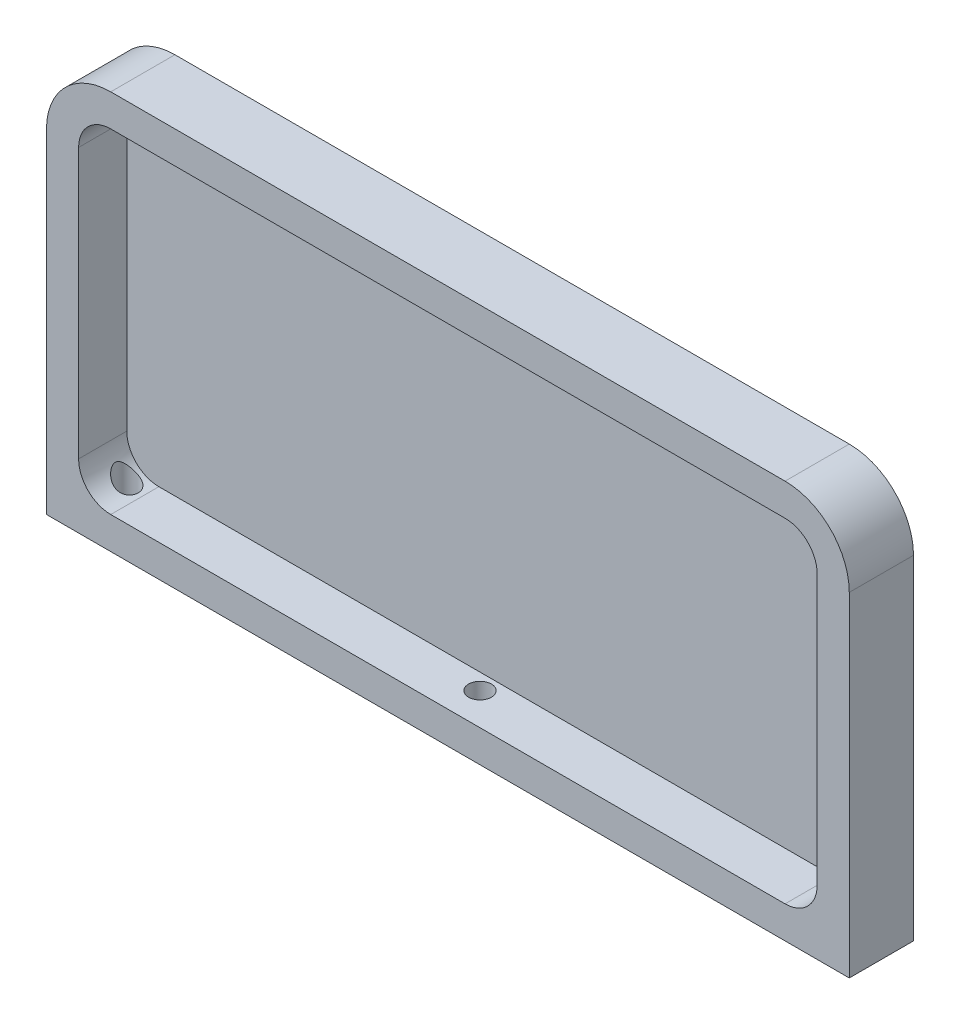
ISO-10303-21;
HEADER;
FILE_DESCRIPTION(('STEP AP214'),'2;1');
FILE_NAME('part.step','',(''),(''),'','','');
FILE_SCHEMA(('AUTOMOTIVE_DESIGN { 1 0 10303 214 1 1 1 1 }'));
ENDSEC;
DATA;
#1=APPLICATION_CONTEXT('core data for automotive mechanical design processes');
#2=APPLICATION_PROTOCOL_DEFINITION('international standard','automotive_design',2000,#1);
#3=PRODUCT_CONTEXT('',#1,'mechanical');
#4=PRODUCT('Part','Part','',(#3));
#5=PRODUCT_RELATED_PRODUCT_CATEGORY('part','',(#4));
#6=PRODUCT_DEFINITION_FORMATION('','',#4);
#7=PRODUCT_DEFINITION_CONTEXT('part definition',#1,'design');
#8=PRODUCT_DEFINITION('design','',#6,#7);
#9=PRODUCT_DEFINITION_SHAPE('','',#8);
#10=(LENGTH_UNIT() NAMED_UNIT(*) SI_UNIT(.MILLI.,.METRE.));
#11=(NAMED_UNIT(*) PLANE_ANGLE_UNIT() SI_UNIT($,.RADIAN.));
#12=(NAMED_UNIT(*) SI_UNIT($,.STERADIAN.) SOLID_ANGLE_UNIT());
#13=UNCERTAINTY_MEASURE_WITH_UNIT(LENGTH_MEASURE(1.E-05),#10,'distance_accuracy_value','');
#14=(GEOMETRIC_REPRESENTATION_CONTEXT(3) GLOBAL_UNCERTAINTY_ASSIGNED_CONTEXT((#13)) GLOBAL_UNIT_ASSIGNED_CONTEXT((#10,
#11,#12)) REPRESENTATION_CONTEXT('',''));
#15=CARTESIAN_POINT('',(0.,0.,0.));
#16=DIRECTION('',(0.,0.,1.));
#17=DIRECTION('',(1.,0.,0.));
#18=AXIS2_PLACEMENT_3D('',#15,#16,#17);
#19=CARTESIAN_POINT('',(39.6875,-19.685,6.35));
#20=DIRECTION('',(-1.,0.,0.));
#21=DIRECTION('',(0.,0.,1.));
#22=AXIS2_PLACEMENT_3D('',#19,#20,#21);
#23=PLANE('',#22);
#24=DIRECTION('',(0.,1.,0.));
#25=VECTOR('',#24,1.);
#26=CARTESIAN_POINT('',(39.6875,-19.685,0.));
#27=LINE('',#26,#25);
#28=CARTESIAN_POINT('',(39.6875,-19.685,0.));
#29=VERTEX_POINT('',#28);
#30=CARTESIAN_POINT('',(39.6875,13.335,0.));
#31=VERTEX_POINT('',#30);
#32=EDGE_CURVE('E225',#29,#31,#27,.T.);
#33=ORIENTED_EDGE('',*,*,#32,.T.);
#34=DIRECTION('',(0.,0.,-1.));
#35=VECTOR('',#34,1.);
#36=CARTESIAN_POINT('',(39.6875,13.335,6.35));
#37=LINE('',#36,#35);
#38=CARTESIAN_POINT('',(39.6875,13.335,6.35));
#39=VERTEX_POINT('',#38);
#40=EDGE_CURVE('E259',#31,#39,#37,.F.);
#41=ORIENTED_EDGE('',*,*,#40,.T.);
#42=DIRECTION('',(0.,1.,0.));
#43=VECTOR('',#42,1.);
#44=CARTESIAN_POINT('',(39.6875,-19.685,6.35));
#45=LINE('',#44,#43);
#46=CARTESIAN_POINT('',(39.6875,-19.685,6.35));
#47=VERTEX_POINT('',#46);
#48=EDGE_CURVE('E226',#47,#39,#45,.T.);
#49=ORIENTED_EDGE('',*,*,#48,.F.);
#50=DIRECTION('',(0.,0.,-1.));
#51=VECTOR('',#50,1.);
#52=CARTESIAN_POINT('',(39.6875,-19.685,6.35));
#53=LINE('',#52,#51);
#54=EDGE_CURVE('E236',#47,#29,#53,.T.);
#55=ORIENTED_EDGE('',*,*,#54,.T.);
#56=EDGE_LOOP('',(#33,#41,#49,#55));
#57=FACE_BOUND('',#56,.T.);
#58=ADVANCED_FACE('F36',(#57),#23,.F.);
#59=CARTESIAN_POINT('',(-39.6875,19.685,6.35));
#60=DIRECTION('',(0.,-1.,0.));
#61=DIRECTION('',(0.,0.,-1.));
#62=AXIS2_PLACEMENT_3D('',#59,#60,#61);
#63=PLANE('',#62);
#64=DIRECTION('',(-1.,0.,0.));
#65=VECTOR('',#64,1.);
#66=CARTESIAN_POINT('',(-39.6875,19.685,6.35));
#67=LINE('',#66,#65);
#68=CARTESIAN_POINT('',(33.3375,19.685,6.35));
#69=VERTEX_POINT('',#68);
#70=CARTESIAN_POINT('',(-33.3375,19.685,6.35));
#71=VERTEX_POINT('',#70);
#72=EDGE_CURVE('E229',#69,#71,#67,.T.);
#73=ORIENTED_EDGE('',*,*,#72,.F.);
#74=DIRECTION('',(0.,0.,-1.));
#75=VECTOR('',#74,1.);
#76=CARTESIAN_POINT('',(33.3375,19.685,6.35));
#77=LINE('',#76,#75);
#78=CARTESIAN_POINT('',(33.3375,19.685,0.));
#79=VERTEX_POINT('',#78);
#80=EDGE_CURVE('E252',#69,#79,#77,.T.);
#81=ORIENTED_EDGE('',*,*,#80,.T.);
#82=DIRECTION('',(-1.,0.,0.));
#83=VECTOR('',#82,1.);
#84=CARTESIAN_POINT('',(-39.6875,19.685,0.));
#85=LINE('',#84,#83);
#86=CARTESIAN_POINT('',(-33.3375,19.685,0.));
#87=VERTEX_POINT('',#86);
#88=EDGE_CURVE('E239',#79,#87,#85,.T.);
#89=ORIENTED_EDGE('',*,*,#88,.T.);
#90=DIRECTION('',(0.,0.,-1.));
#91=VECTOR('',#90,1.);
#92=CARTESIAN_POINT('',(-33.3375,19.685,6.35));
#93=LINE('',#92,#91);
#94=EDGE_CURVE('E250',#87,#71,#93,.F.);
#95=ORIENTED_EDGE('',*,*,#94,.T.);
#96=EDGE_LOOP('',(#73,#81,#89,#95));
#97=FACE_BOUND('',#96,.T.);
#98=ADVANCED_FACE('F310',(#97),#63,.F.);
#99=CARTESIAN_POINT('',(-39.6875,-19.685,6.35));
#100=DIRECTION('',(1.,0.,0.));
#101=DIRECTION('',(0.,0.,-1.));
#102=AXIS2_PLACEMENT_3D('',#99,#100,#101);
#103=PLANE('',#102);
#104=DIRECTION('',(0.,-1.,0.));
#105=VECTOR('',#104,1.);
#106=CARTESIAN_POINT('',(-39.6875,-19.685,6.35));
#107=LINE('',#106,#105);
#108=CARTESIAN_POINT('',(-39.6875,13.335,6.35));
#109=VERTEX_POINT('',#108);
#110=CARTESIAN_POINT('',(-39.6875,-19.685,6.35));
#111=VERTEX_POINT('',#110);
#112=EDGE_CURVE('E232',#109,#111,#107,.T.);
#113=ORIENTED_EDGE('',*,*,#112,.F.);
#114=DIRECTION('',(0.,0.,-1.));
#115=VECTOR('',#114,1.);
#116=CARTESIAN_POINT('',(-39.6875,13.335,6.35));
#117=LINE('',#116,#115);
#118=CARTESIAN_POINT('',(-39.6875,13.335,0.));
#119=VERTEX_POINT('',#118);
#120=EDGE_CURVE('E11',#109,#119,#117,.T.);
#121=ORIENTED_EDGE('',*,*,#120,.T.);
#122=DIRECTION('',(0.,-1.,0.));
#123=VECTOR('',#122,1.);
#124=CARTESIAN_POINT('',(-39.6875,-19.685,0.));
#125=LINE('',#124,#123);
#126=CARTESIAN_POINT('',(-39.6875,-19.685,0.));
#127=VERTEX_POINT('',#126);
#128=EDGE_CURVE('E242',#119,#127,#125,.T.);
#129=ORIENTED_EDGE('',*,*,#128,.T.);
#130=DIRECTION('',(0.,0.,-1.));
#131=VECTOR('',#130,1.);
#132=CARTESIAN_POINT('',(-39.6875,-19.685,6.35));
#133=LINE('',#132,#131);
#134=EDGE_CURVE('E247',#111,#127,#133,.T.);
#135=ORIENTED_EDGE('',*,*,#134,.F.);
#136=EDGE_LOOP('',(#113,#121,#129,#135));
#137=FACE_BOUND('',#136,.T.);
#138=ADVANCED_FACE('F316',(#137),#103,.F.);
#139=CARTESIAN_POINT('',(-39.6875,-19.685,6.35));
#140=DIRECTION('',(0.,1.,0.));
#141=DIRECTION('',(0.,0.,1.));
#142=AXIS2_PLACEMENT_3D('',#139,#140,#141);
#143=PLANE('',#142);
#144=CARTESIAN_POINT('',(0.,-19.685,3.175));
#145=DIRECTION('',(0.,-1.,0.));
#146=DIRECTION('',(0.,0.,-1.));
#147=AXIS2_PLACEMENT_3D('',#144,#145,#146);
#148=CIRCLE('',#147,1.13029999999999);
#149=CARTESIAN_POINT('',(0.,-19.685,2.04470000000001));
#150=VERTEX_POINT('',#149);
#151=EDGE_CURVE('E216',#150,#150,#148,.T.);
#152=ORIENTED_EDGE('',*,*,#151,.F.);
#153=EDGE_LOOP('',(#152));
#154=FACE_BOUND('',#153,.T.);
#155=CARTESIAN_POINT('',(-34.925,-19.685,3.175));
#156=DIRECTION('',(0.,-1.,0.));
#157=DIRECTION('',(0.,0.,-1.));
#158=AXIS2_PLACEMENT_3D('',#155,#156,#157);
#159=CIRCLE('',#158,1.13029999999999);
#160=CARTESIAN_POINT('',(-34.925,-19.685,2.04470000000001));
#161=VERTEX_POINT('',#160);
#162=EDGE_CURVE('E219',#161,#161,#159,.T.);
#163=ORIENTED_EDGE('',*,*,#162,.F.);
#164=EDGE_LOOP('',(#163));
#165=FACE_BOUND('',#164,.T.);
#166=CARTESIAN_POINT('',(34.925,-19.685,3.175));
#167=DIRECTION('',(0.,-1.,0.));
#168=DIRECTION('',(0.,0.,-1.));
#169=AXIS2_PLACEMENT_3D('',#166,#167,#168);
#170=CIRCLE('',#169,1.13029999999999);
#171=CARTESIAN_POINT('',(34.925,-19.685,2.04470000000001));
#172=VERTEX_POINT('',#171);
#173=EDGE_CURVE('E222',#172,#172,#170,.T.);
#174=ORIENTED_EDGE('',*,*,#173,.F.);
#175=EDGE_LOOP('',(#174));
#176=FACE_BOUND('',#175,.T.);
#177=DIRECTION('',(1.,0.,0.));
#178=VECTOR('',#177,1.);
#179=CARTESIAN_POINT('',(-39.6875,-19.685,0.));
#180=LINE('',#179,#178);
#181=EDGE_CURVE('E230',#127,#29,#180,.T.);
#182=ORIENTED_EDGE('',*,*,#181,.T.);
#183=ORIENTED_EDGE('',*,*,#54,.F.);
#184=DIRECTION('',(1.,0.,0.));
#185=VECTOR('',#184,1.);
#186=CARTESIAN_POINT('',(-39.6875,-19.685,6.35));
#187=LINE('',#186,#185);
#188=EDGE_CURVE('E234',#111,#47,#187,.T.);
#189=ORIENTED_EDGE('',*,*,#188,.F.);
#190=ORIENTED_EDGE('',*,*,#134,.T.);
#191=EDGE_LOOP('',(#182,#183,#189,#190));
#192=FACE_BOUND('',#191,.T.);
#193=ADVANCED_FACE('F347',(#154,#165,#176,#192),#143,.F.);
#194=CARTESIAN_POINT('',(39.6875,19.685,6.35));
#195=DIRECTION('',(0.,0.,-1.));
#196=DIRECTION('',(-1.,0.,0.));
#197=AXIS2_PLACEMENT_3D('',#194,#195,#196);
#198=PLANE('',#197);
#199=DIRECTION('',(0.,1.,0.));
#200=VECTOR('',#199,1.);
#201=CARTESIAN_POINT('',(36.5125,-13.335,6.35));
#202=LINE('',#201,#200);
#203=CARTESIAN_POINT('',(36.5125,-13.335,6.35));
#204=VERTEX_POINT('',#203);
#205=CARTESIAN_POINT('',(36.5125,13.335,6.35));
#206=VERTEX_POINT('',#205);
#207=EDGE_CURVE('E186',#204,#206,#202,.T.);
#208=ORIENTED_EDGE('',*,*,#207,.F.);
#209=CARTESIAN_POINT('',(33.3375,-13.335,6.35));
#210=DIRECTION('',(0.,0.,1.));
#211=DIRECTION('',(-1.,0.,0.));
#212=AXIS2_PLACEMENT_3D('',#209,#210,#211);
#213=CIRCLE('',#212,3.175);
#214=CARTESIAN_POINT('',(33.3375,-16.51,6.35));
#215=VERTEX_POINT('',#214);
#216=EDGE_CURVE('E57',#215,#204,#213,.T.);
#217=ORIENTED_EDGE('',*,*,#216,.F.);
#218=DIRECTION('',(1.,0.,0.));
#219=VECTOR('',#218,1.);
#220=CARTESIAN_POINT('',(-33.3375,-16.51,6.35));
#221=LINE('',#220,#219);
#222=CARTESIAN_POINT('',(-33.3375,-16.51,6.35));
#223=VERTEX_POINT('',#222);
#224=EDGE_CURVE('E166',#223,#215,#221,.T.);
#225=ORIENTED_EDGE('',*,*,#224,.F.);
#226=CARTESIAN_POINT('',(-33.3375,-13.335,6.35));
#227=DIRECTION('',(0.,0.,1.));
#228=DIRECTION('',(1.,0.,0.));
#229=AXIS2_PLACEMENT_3D('',#226,#227,#228);
#230=CIRCLE('',#229,3.175);
#231=CARTESIAN_POINT('',(-36.5125,-13.335,6.35));
#232=VERTEX_POINT('',#231);
#233=EDGE_CURVE('E169',#232,#223,#230,.T.);
#234=ORIENTED_EDGE('',*,*,#233,.F.);
#235=DIRECTION('',(0.,-1.,0.));
#236=VECTOR('',#235,1.);
#237=CARTESIAN_POINT('',(-36.5125,13.335,6.35));
#238=LINE('',#237,#236);
#239=CARTESIAN_POINT('',(-36.5125,13.335,6.35));
#240=VERTEX_POINT('',#239);
#241=EDGE_CURVE('E197',#240,#232,#238,.T.);
#242=ORIENTED_EDGE('',*,*,#241,.F.);
#243=CARTESIAN_POINT('',(-33.3375,13.335,6.35));
#244=DIRECTION('',(0.,0.,1.));
#245=DIRECTION('',(1.,0.,0.));
#246=AXIS2_PLACEMENT_3D('',#243,#244,#245);
#247=CIRCLE('',#246,3.175);
#248=CARTESIAN_POINT('',(-33.3375,16.51,6.35));
#249=VERTEX_POINT('',#248);
#250=EDGE_CURVE('E194',#249,#240,#247,.T.);
#251=ORIENTED_EDGE('',*,*,#250,.F.);
#252=DIRECTION('',(-1.,0.,0.));
#253=VECTOR('',#252,1.);
#254=CARTESIAN_POINT('',(33.3375,16.51,6.35));
#255=LINE('',#254,#253);
#256=CARTESIAN_POINT('',(33.3375,16.51,6.35));
#257=VERTEX_POINT('',#256);
#258=EDGE_CURVE('E191',#257,#249,#255,.T.);
#259=ORIENTED_EDGE('',*,*,#258,.F.);
#260=CARTESIAN_POINT('',(33.3375,13.335,6.35));
#261=DIRECTION('',(0.,0.,1.));
#262=DIRECTION('',(1.,0.,0.));
#263=AXIS2_PLACEMENT_3D('',#260,#261,#262);
#264=CIRCLE('',#263,3.175);
#265=EDGE_CURVE('E188',#206,#257,#264,.T.);
#266=ORIENTED_EDGE('',*,*,#265,.F.);
#267=EDGE_LOOP('',(#208,#217,#225,#234,#242,#251,#259,#266));
#268=FACE_BOUND('',#267,.T.);
#269=ORIENTED_EDGE('',*,*,#48,.T.);
#270=CARTESIAN_POINT('',(33.3375,13.335,6.35));
#271=DIRECTION('',(0.,0.,-1.));
#272=DIRECTION('',(-1.,0.,0.));
#273=AXIS2_PLACEMENT_3D('',#270,#271,#272);
#274=CIRCLE('',#273,6.35);
#275=EDGE_CURVE('E49',#39,#69,#274,.F.);
#276=ORIENTED_EDGE('',*,*,#275,.T.);
#277=ORIENTED_EDGE('',*,*,#72,.T.);
#278=CARTESIAN_POINT('',(-33.3375,13.335,6.35));
#279=DIRECTION('',(0.,0.,-1.));
#280=DIRECTION('',(-1.,0.,0.));
#281=AXIS2_PLACEMENT_3D('',#278,#279,#280);
#282=CIRCLE('',#281,6.35);
#283=EDGE_CURVE('E65',#71,#109,#282,.F.);
#284=ORIENTED_EDGE('',*,*,#283,.T.);
#285=ORIENTED_EDGE('',*,*,#112,.T.);
#286=ORIENTED_EDGE('',*,*,#188,.T.);
#287=EDGE_LOOP('',(#269,#276,#277,#284,#285,#286));
#288=FACE_BOUND('',#287,.T.);
#289=ADVANCED_FACE('F329',(#268,#288),#198,.F.);
#290=CARTESIAN_POINT('',(39.6875,19.685,0.));
#291=DIRECTION('',(0.,0.,-1.));
#292=DIRECTION('',(-1.,0.,0.));
#293=AXIS2_PLACEMENT_3D('',#290,#291,#292);
#294=PLANE('',#293);
#295=ORIENTED_EDGE('',*,*,#88,.F.);
#296=CARTESIAN_POINT('',(33.3375,13.335,0.));
#297=DIRECTION('',(0.,0.,-1.));
#298=DIRECTION('',(-1.,0.,0.));
#299=AXIS2_PLACEMENT_3D('',#296,#297,#298);
#300=CIRCLE('',#299,6.35);
#301=EDGE_CURVE('E257',#79,#31,#300,.T.);
#302=ORIENTED_EDGE('',*,*,#301,.T.);
#303=ORIENTED_EDGE('',*,*,#32,.F.);
#304=ORIENTED_EDGE('',*,*,#181,.F.);
#305=ORIENTED_EDGE('',*,*,#128,.F.);
#306=CARTESIAN_POINT('',(-33.3375,13.335,0.));
#307=DIRECTION('',(0.,0.,-1.));
#308=DIRECTION('',(-1.,0.,0.));
#309=AXIS2_PLACEMENT_3D('',#306,#307,#308);
#310=CIRCLE('',#309,6.35);
#311=EDGE_CURVE('E255',#119,#87,#310,.T.);
#312=ORIENTED_EDGE('',*,*,#311,.T.);
#313=EDGE_LOOP('',(#295,#302,#303,#304,#305,#312));
#314=FACE_BOUND('',#313,.T.);
#315=ADVANCED_FACE('F322',(#314),#294,.T.);
#316=CARTESIAN_POINT('',(33.3375,13.335,6.35));
#317=DIRECTION('',(0.,0.,-1.));
#318=DIRECTION('',(-1.,0.,0.));
#319=AXIS2_PLACEMENT_3D('',#316,#317,#318);
#320=CYLINDRICAL_SURFACE('',#319,6.35);
#321=ORIENTED_EDGE('',*,*,#275,.F.);
#322=ORIENTED_EDGE('',*,*,#40,.F.);
#323=ORIENTED_EDGE('',*,*,#301,.F.);
#324=ORIENTED_EDGE('',*,*,#80,.F.);
#325=EDGE_LOOP('',(#321,#322,#323,#324));
#326=FACE_BOUND('',#325,.T.);
#327=ADVANCED_FACE('F320',(#326),#320,.T.);
#328=CARTESIAN_POINT('',(-33.3375,13.335,6.35));
#329=DIRECTION('',(0.,0.,-1.));
#330=DIRECTION('',(-1.,0.,0.));
#331=AXIS2_PLACEMENT_3D('',#328,#329,#330);
#332=CYLINDRICAL_SURFACE('',#331,6.35);
#333=ORIENTED_EDGE('',*,*,#283,.F.);
#334=ORIENTED_EDGE('',*,*,#94,.F.);
#335=ORIENTED_EDGE('',*,*,#311,.F.);
#336=ORIENTED_EDGE('',*,*,#120,.F.);
#337=EDGE_LOOP('',(#333,#334,#335,#336));
#338=FACE_BOUND('',#337,.T.);
#339=ADVANCED_FACE('F38',(#338),#332,.T.);
#340=CARTESIAN_POINT('',(34.925,-19.685,3.175));
#341=DIRECTION('',(0.,-1.,0.));
#342=DIRECTION('',(0.,0.,-1.));
#343=AXIS2_PLACEMENT_3D('',#340,#341,#342);
#344=CYLINDRICAL_SURFACE('',#343,1.13029999999999);
#345=CARTESIAN_POINT('',(34.925,-16.0846306570156,2.04470000000001));
#346=CARTESIAN_POINT('',(34.8657046296467,-16.1188592354618,2.04470361485875));
#347=CARTESIAN_POINT('',(34.8052276070526,-16.1512017965754,2.04937802834855));
#348=CARTESIAN_POINT('',(34.6835730291809,-16.211339464064,2.06906480410062));
#349=CARTESIAN_POINT('',(34.622394649308,-16.2391284662757,2.08409090497596));
#350=CARTESIAN_POINT('',(34.5013057725825,-16.2897422687728,2.12516125452423));
#351=CARTESIAN_POINT('',(34.4414019623174,-16.3125449094795,2.15125323033481));
#352=CARTESIAN_POINT('',(34.3257484356765,-16.3529039245629,2.21437051783543));
#353=CARTESIAN_POINT('',(34.2699960525221,-16.3704636890471,2.25138873355392));
#354=CARTESIAN_POINT('',(34.1694444661813,-16.3994762677229,2.33207132363825));
#355=CARTESIAN_POINT('',(34.1241233758781,-16.4113093395822,2.37495135909174));
#356=CARTESIAN_POINT('',(34.0408458122602,-16.4314122503417,2.46807036528957));
#357=CARTESIAN_POINT('',(34.0028890698828,-16.4396822194362,2.51830906706111));
#358=CARTESIAN_POINT('',(33.9365566755399,-16.4531529407197,2.62334614664333));
#359=CARTESIAN_POINT('',(33.9079664814005,-16.4584248184784,2.6780002927181));
#360=CARTESIAN_POINT('',(33.8600144813096,-16.4668044034582,2.79136976889975));
#361=CARTESIAN_POINT('',(33.8406527743712,-16.4699120874598,2.85008514257208));
#362=CARTESIAN_POINT('',(33.8115852597009,-16.4744409394473,2.97061798399661));
#363=CARTESIAN_POINT('',(33.801989831151,-16.4758428626747,3.03246279527803));
#364=CARTESIAN_POINT('',(33.7931243752648,-16.4771412890933,3.15690589411187));
#365=CARTESIAN_POINT('',(33.7938549960681,-16.4770376977871,3.21950422871461));
#366=CARTESIAN_POINT('',(33.8056662669438,-16.4752994811657,3.34417316419074));
#367=CARTESIAN_POINT('',(33.8168247063721,-16.4736533485617,3.4062362567655));
#368=CARTESIAN_POINT('',(33.8492638453936,-16.4685267737471,3.52758147701625));
#369=CARTESIAN_POINT('',(33.8705445548354,-16.4650463297518,3.58686360198638));
#370=CARTESIAN_POINT('',(33.9224886005307,-16.4557537699045,3.70079293802708));
#371=CARTESIAN_POINT('',(33.9531286488033,-16.4499474303223,3.75545122790844));
#372=CARTESIAN_POINT('',(34.0227758568201,-16.4353681269822,3.85870004404669));
#373=CARTESIAN_POINT('',(34.06178174212,-16.4265956149713,3.90729149273894));
#374=CARTESIAN_POINT('',(34.1462559970834,-16.4055708616348,3.99650155191576));
#375=CARTESIAN_POINT('',(34.1916428800048,-16.3933608018451,4.03720728942099));
#376=CARTESIAN_POINT('',(34.2875335175481,-16.3649433575324,4.1103340901904));
#377=CARTESIAN_POINT('',(34.3380366478509,-16.3487364603852,4.14275616258682));
#378=CARTESIAN_POINT('',(34.4422275385233,-16.3121201326094,4.19872008659796));
#379=CARTESIAN_POINT('',(34.4959113732721,-16.2917158085647,4.2222726312241));
#380=CARTESIAN_POINT('',(34.6046706884259,-16.2467636933127,4.26049203389766));
#381=CARTESIAN_POINT('',(34.6597464536764,-16.2222150480746,4.27515705760633));
#382=CARTESIAN_POINT('',(34.7727611025152,-16.1678080102539,4.29655907375222));
#383=CARTESIAN_POINT('',(34.8306856198313,-16.1377277438561,4.3028004155036));
#384=CARTESIAN_POINT('',(34.9447542812551,-16.0739121242528,4.30656966432408));
#385=CARTESIAN_POINT('',(35.0008976127898,-16.0401751329918,4.30409365062764));
#386=CARTESIAN_POINT('',(35.118137680843,-15.9647293221941,4.29045397155967));
#387=CARTESIAN_POINT('',(35.1788033022915,-15.9225691319882,4.27810482689242));
#388=CARTESIAN_POINT('',(35.2954869916385,-15.8354455377174,4.24458336907102));
#389=CARTESIAN_POINT('',(35.3515020132864,-15.7904803295451,4.22340532661612));
#390=CARTESIAN_POINT('',(35.4692501402293,-15.6894513034488,4.16818680941738));
#391=CARTESIAN_POINT('',(35.5298261676296,-15.6329914505622,4.13240561183525));
#392=CARTESIAN_POINT('',(35.6430704083817,-15.5193546310677,4.05069477718503));
#393=CARTESIAN_POINT('',(35.695729870037,-15.4621769454409,4.0047540454207));
#394=CARTESIAN_POINT('',(35.7853052203626,-15.358081964376,3.91054084665467));
#395=CARTESIAN_POINT('',(35.8233977785732,-15.3109147575913,3.86365798683824));
#396=CARTESIAN_POINT('',(35.892855262318,-15.2202078698317,3.76204258117488));
#397=CARTESIAN_POINT('',(35.9242359581987,-15.1766598358524,3.70732895151676));
#398=CARTESIAN_POINT('',(35.9673848769802,-15.1140795609394,3.61367877089166));
#399=CARTESIAN_POINT('',(35.9818580099714,-15.0924267886307,3.57775287992994));
#400=CARTESIAN_POINT('',(36.0075053952018,-15.0532086374079,3.50261455687383));
#401=CARTESIAN_POINT('',(36.018684670852,-15.0356370431091,3.46340724772664));
#402=CARTESIAN_POINT('',(36.0352088299971,-15.0092724717482,3.38981483133157));
#403=CARTESIAN_POINT('',(36.041265094585,-14.9994374371252,3.35597157739836));
#404=CARTESIAN_POINT('',(36.0502913920547,-14.9846862547386,3.28683704694496));
#405=CARTESIAN_POINT('',(36.0532659335289,-14.9797629214977,3.25154796454478));
#406=CARTESIAN_POINT('',(36.0558509092633,-14.9754880816333,3.18032671185706));
#407=CARTESIAN_POINT('',(36.0554453401398,-14.9761630806546,3.14439228704148));
#408=CARTESIAN_POINT('',(36.0512766828988,-14.9830459216336,3.0732518384369));
#409=CARTESIAN_POINT('',(36.0475104061653,-14.9892590180936,3.03804653890279));
#410=CARTESIAN_POINT('',(36.0358310382949,-15.0082545022786,2.96187425522728));
#411=CARTESIAN_POINT('',(36.0271974908874,-15.0221666937532,2.9213070260613));
#412=CARTESIAN_POINT('',(36.0062883489287,-15.0550505733862,2.84328543618616));
#413=CARTESIAN_POINT('',(35.9940039993092,-15.0740344127862,2.80583883872942));
#414=CARTESIAN_POINT('',(35.9578749355051,-15.1282840561178,2.71169553018543));
#415=CARTESIAN_POINT('',(35.9315982657171,-15.1663209405377,2.65755647380489));
#416=CARTESIAN_POINT('',(35.8728376434679,-15.2468578405823,2.55644499528357));
#417=CARTESIAN_POINT('',(35.8403366593438,-15.2893699546614,2.50949288829853));
#418=CARTESIAN_POINT('',(35.7793566148593,-15.3646897779107,2.43383294083695));
#419=CARTESIAN_POINT('',(35.752149219734,-15.3970300324528,2.40361581122888));
#420=CARTESIAN_POINT('',(35.6949484343497,-15.4621923280738,2.34651186706823));
#421=CARTESIAN_POINT('',(35.6649538133733,-15.4950145765425,2.31962653603719));
#422=CARTESIAN_POINT('',(35.5709241419071,-15.5934593165506,2.24395925863744));
#423=CARTESIAN_POINT('',(35.5027972577613,-15.6591180744242,2.20010946186341));
#424=CARTESIAN_POINT('',(35.3676200316278,-15.7775556424707,2.13266089343669));
#425=CARTESIAN_POINT('',(35.3019725629,-15.8307779218634,2.10699972376187));
#426=CARTESIAN_POINT('',(35.1643657469388,-15.9331649863236,2.06804287411692));
#427=CARTESIAN_POINT('',(35.0924332296763,-15.982345431919,2.05469719725469));
#428=CARTESIAN_POINT('',(34.987523609923,-16.0478171144026,2.04600829853784));
#429=CARTESIAN_POINT('',(34.9564277810606,-16.0664887976594,2.04469808404961));
#430=CARTESIAN_POINT('',(34.925,-16.0846306570156,2.04470000000001));
#431=B_SPLINE_CURVE_WITH_KNOTS('',3,(#345,#346,#347,#348,#349,#350,#351,#352,#353,#354,#355,
#356,#357,#358,#359,#360,#361,#362,#363,#364,#365,#366,#367,#368,#369,#370,#371,#372,#373,#374,
#375,#376,#377,#378,#379,#380,#381,#382,#383,#384,#385,#386,#387,#388,#389,#390,#391,#392,#393,
#394,#395,#396,#397,#398,#399,#400,#401,#402,#403,#404,#405,#406,#407,#408,#409,#410,#411,#412,
#413,#414,#415,#416,#417,#418,#419,#420,#421,#422,#423,#424,#425,#426,#427,#428,#429,#430),
.UNSPECIFIED.,.T.,.F.,(4,2,2,2,2,2,2,2,2,2,2,2,2,2,2,2,2,2,2,2,2,2,2,2,2,2,2,2,2,2,2,2,2,2,2,2,
2,2,2,2,2,2,4),(0.,0.205299180713226,0.410871357836099,0.617339332172765,0.823673511237518,
1.01324368264421,1.20280692664033,1.38766220372031,1.57251946407975,1.75944354152621,
1.94637935176958,2.1347208913305,2.32306261414283,2.51093946915313,2.69878772347216,
2.88442450238747,3.0700386558736,3.25542831295664,3.4408562204947,3.63677826134667,
3.83278843242352,4.05667523474698,4.28070754973251,4.55034355278021,4.82027547819718,
5.04961419658675,5.27840798733303,5.41121802689966,5.54382445887748,5.6506828691886,
5.75738472283342,5.86459205025308,5.97190120351998,6.10240888960704,6.23323210979937,
6.44563624495263,6.65863010995759,6.81430080647212,6.97004056998976,7.28124329446686,
7.54526217334022,7.80820444463556,7.91701728558649),.UNSPECIFIED.);
#432=CARTESIAN_POINT('',(34.925,-16.0846306570156,2.04470000000001));
#433=VERTEX_POINT('',#432);
#434=EDGE_CURVE('E40',#433,#433,#431,.T.);
#435=ORIENTED_EDGE('',*,*,#434,.T.);
#436=EDGE_LOOP('',(#435));
#437=FACE_BOUND('',#436,.T.);
#438=ORIENTED_EDGE('',*,*,#173,.T.);
#439=EDGE_LOOP('',(#438));
#440=FACE_BOUND('',#439,.T.);
#441=ADVANCED_FACE('F306',(#437,#440),#344,.F.);
#442=CARTESIAN_POINT('',(-34.925,-19.685,3.175));
#443=DIRECTION('',(0.,-1.,0.));
#444=DIRECTION('',(0.,0.,-1.));
#445=AXIS2_PLACEMENT_3D('',#442,#443,#444);
#446=CYLINDRICAL_SURFACE('',#445,1.13029999999999);
#447=CARTESIAN_POINT('',(-34.925,-16.0846306570156,2.04470000000001));
#448=CARTESIAN_POINT('',(-35.0084377320562,-16.0364483248277,2.04470389502463));
#449=CARTESIAN_POINT('',(-35.0897433717963,-15.9843822779059,2.05396581101098));
#450=CARTESIAN_POINT('',(-35.245183289382,-15.8747830977672,2.08805802062409));
#451=CARTESIAN_POINT('',(-35.3192931582595,-15.8172325845505,2.11293930340576));
#452=CARTESIAN_POINT('',(-35.4514068818507,-15.705378668519,2.1724320094522));
#453=CARTESIAN_POINT('',(-35.5102855883284,-15.6513864342299,2.20571791753991));
#454=CARTESIAN_POINT('',(-35.6207433294252,-15.5425837584092,2.28168248181682));
#455=CARTESIAN_POINT('',(-35.6723239941138,-15.4877735026217,2.32435903508011));
#456=CARTESIAN_POINT('',(-35.7647445276334,-15.3828483798487,2.4158137505278));
#457=CARTESIAN_POINT('',(-35.8060610589579,-15.332657807036,2.46402513384878));
#458=CARTESIAN_POINT('',(-35.8813403903437,-15.2358459944428,2.56905867331348));
#459=CARTESIAN_POINT('',(-35.9153188754281,-15.1892172820017,2.62586201295918));
#460=CARTESIAN_POINT('',(-35.9611915340258,-15.1232127006529,2.72188277099282));
#461=CARTESIAN_POINT('',(-35.976174515776,-15.1009606255562,2.75763665666137));
#462=CARTESIAN_POINT('',(-36.002879172947,-15.0603878943404,2.83246679811854));
#463=CARTESIAN_POINT('',(-36.0146055750548,-15.0420615492459,2.87153813010363));
#464=CARTESIAN_POINT('',(-36.0322184570093,-15.014089167238,2.94522696443827));
#465=CARTESIAN_POINT('',(-36.0387887426775,-15.0034585106896,2.97929827764194));
#466=CARTESIAN_POINT('',(-36.0488095581197,-14.9871257214762,3.04904007032099));
#467=CARTESIAN_POINT('',(-36.0522648388002,-14.9814160840161,3.0847080271279));
#468=CARTESIAN_POINT('',(-36.0557348396234,-14.9756821072665,3.15689534602728));
#469=CARTESIAN_POINT('',(-36.055729492764,-14.975690927368,3.19341844583637));
#470=CARTESIAN_POINT('',(-36.0522287227954,-14.9814757895556,3.26583841844577));
#471=CARTESIAN_POINT('',(-36.0487303721387,-14.9872566693057,3.3017347402549));
#472=CARTESIAN_POINT('',(-36.0376902206954,-15.0052467498441,3.37807624963077));
#473=CARTESIAN_POINT('',(-36.0295421195805,-15.0184129815171,3.41820138103282));
#474=CARTESIAN_POINT('',(-36.0096558728677,-15.0498041829843,3.49546921869231));
#475=CARTESIAN_POINT('',(-35.9979093386965,-15.0680409638352,3.53260469736772));
#476=CARTESIAN_POINT('',(-35.9634007150465,-15.1201441511626,3.62562111457356));
#477=CARTESIAN_POINT('',(-35.9382957923885,-15.1567472178104,3.67907261464822));
#478=CARTESIAN_POINT('',(-35.8820771558628,-15.2344941530539,3.77905320546873));
#479=CARTESIAN_POINT('',(-35.8509472837237,-15.2756501018974,3.8255630716884));
#480=CARTESIAN_POINT('',(-35.7920397693931,-15.3493203317878,3.90128529290762));
#481=CARTESIAN_POINT('',(-35.7654311557308,-15.3813624400673,3.93188440035297));
#482=CARTESIAN_POINT('',(-35.7094368536741,-15.4460125848123,3.98977596818719));
#483=CARTESIAN_POINT('',(-35.6800499804163,-15.4786208578503,4.01706700633483));
#484=CARTESIAN_POINT('',(-35.5878381621029,-15.5765654543876,4.09404533532565));
#485=CARTESIAN_POINT('',(-35.5209498814327,-15.6420371201152,4.13885326166741));
#486=CARTESIAN_POINT('',(-35.3766401684368,-15.7705606923365,4.21436107869286));
#487=CARTESIAN_POINT('',(-35.2991532860689,-15.8335941682953,4.24496766189877));
#488=CARTESIAN_POINT('',(-35.1353432811608,-15.9538940936043,4.28876226572124));
#489=CARTESIAN_POINT('',(-35.0490481790848,-16.0111777477247,4.30200377423396));
#490=CARTESIAN_POINT('',(-34.8997904682655,-16.0999236503846,4.30662022334018));
#491=CARTESIAN_POINT('',(-34.8383751816131,-16.1337218768474,4.30370941193735));
#492=CARTESIAN_POINT('',(-34.7145540643492,-16.1966688589078,4.28728620157389));
#493=CARTESIAN_POINT('',(-34.6521488943041,-16.2258205826235,4.27378060332785));
#494=CARTESIAN_POINT('',(-34.5282029940441,-16.2790497753364,4.23535901066601));
#495=CARTESIAN_POINT('',(-34.4666691321032,-16.3030976715381,4.21037903560425));
#496=CARTESIAN_POINT('',(-34.3475320046813,-16.3457248311071,4.14895744317));
#497=CARTESIAN_POINT('',(-34.2899275823366,-16.3643057093998,4.11251921709132));
#498=CARTESIAN_POINT('',(-34.1865988014856,-16.3947852996041,4.03300975883091));
#499=CARTESIAN_POINT('',(-34.1402651604581,-16.4071530670611,3.99090591521442));
#500=CARTESIAN_POINT('',(-34.0548472611541,-16.4282145806027,3.89911339103585));
#501=CARTESIAN_POINT('',(-34.0157618658549,-16.4369089032097,3.8494259023432));
#502=CARTESIAN_POINT('',(-33.9473125276731,-16.4510783220982,3.74549475675955));
#503=CARTESIAN_POINT('',(-33.917695061944,-16.4566410945766,3.69142950970961));
#504=CARTESIAN_POINT('',(-33.8675950491955,-16.4655389951003,3.5790515790973));
#505=CARTESIAN_POINT('',(-33.8471126529333,-16.4688740863823,3.52073882545629));
#506=CARTESIAN_POINT('',(-33.815744864428,-16.4738157360393,3.40085591904161));
#507=CARTESIAN_POINT('',(-33.8049633421472,-16.475403625876,3.33925782204797));
#508=CARTESIAN_POINT('',(-33.7936930032548,-16.4770607759076,3.21510486770269));
#509=CARTESIAN_POINT('',(-33.7932048527242,-16.4771299378261,3.15254994869751));
#510=CARTESIAN_POINT('',(-33.8025755204998,-16.4757566202982,3.02772532778656));
#511=CARTESIAN_POINT('',(-33.8125180010737,-16.4743019183457,2.9654620177866));
#512=CARTESIAN_POINT('',(-33.8425786068948,-16.4696052090254,2.84350983169704));
#513=CARTESIAN_POINT('',(-33.8626968132679,-16.4663631874081,2.78382097613637));
#514=CARTESIAN_POINT('',(-33.91242811552,-16.4576135599281,2.66884641289391));
#515=CARTESIAN_POINT('',(-33.9420234578725,-16.4521101848449,2.61355271161981));
#516=CARTESIAN_POINT('',(-34.0097287167929,-16.4382116633367,2.50886122048432));
#517=CARTESIAN_POINT('',(-34.047837229545,-16.4298169935606,2.45946246060934));
#518=CARTESIAN_POINT('',(-34.1307269526152,-16.4096072190844,2.36849444746325));
#519=CARTESIAN_POINT('',(-34.1754264646798,-16.3978325224266,2.32684175668046));
#520=CARTESIAN_POINT('',(-34.2701675961094,-16.3703226641184,2.25173048072709));
#521=CARTESIAN_POINT('',(-34.3202092016575,-16.3545875127115,2.2182718743637));
#522=CARTESIAN_POINT('',(-34.4236212535259,-16.3189481605803,2.16025626101021));
#523=CARTESIAN_POINT('',(-34.4769821082953,-16.2990556131557,2.13567488546975));
#524=CARTESIAN_POINT('',(-34.5852809146337,-16.2551159739687,2.09541435193669));
#525=CARTESIAN_POINT('',(-34.6402181311429,-16.231070793154,2.07973111338642));
#526=CARTESIAN_POINT('',(-34.7337688205577,-16.1868231721662,2.06029266545017));
#527=CARTESIAN_POINT('',(-34.7724120928934,-16.1675827362611,2.05438272652128));
#528=CARTESIAN_POINT('',(-34.8491819063823,-16.1273691570947,2.04658569078535));
#529=CARTESIAN_POINT('',(-34.8873084926478,-16.1063961662541,2.04469824049211));
#530=CARTESIAN_POINT('',(-34.925,-16.0846306570156,2.04470000000001));
#531=B_SPLINE_CURVE_WITH_KNOTS('',3,(#447,#448,#449,#450,#451,#452,#453,#454,#455,#456,#457,
#458,#459,#460,#461,#462,#463,#464,#465,#466,#467,#468,#469,#470,#471,#472,#473,#474,#475,#476,
#477,#478,#479,#480,#481,#482,#483,#484,#485,#486,#487,#488,#489,#490,#491,#492,#493,#494,#495,
#496,#497,#498,#499,#500,#501,#502,#503,#504,#505,#506,#507,#508,#509,#510,#511,#512,#513,#514,
#515,#516,#517,#518,#519,#520,#521,#522,#523,#524,#525,#526,#527,#528,#529,#530),.UNSPECIFIED.,
.T.,.F.,(4,2,2,2,2,2,2,2,2,2,2,2,2,2,2,2,2,2,2,2,2,2,2,2,2,2,2,2,2,2,2,2,2,2,2,2,2,2,2,2,2,4),
(0.,0.288841890763092,0.578631639626601,0.837423041878631,1.09615654967518,1.33829817809593,
1.57991699219022,1.71371715934826,1.84732209812615,1.95577577340017,2.06406375735837,
2.17297967209885,2.28198694786025,2.41029665297478,2.5389077763166,2.74619417112262,
2.954044388291,3.10889898708244,3.26381992827271,3.57358755437261,3.88536259919684,
4.19617504135312,4.40582691954845,4.61534433377324,4.8260444613196,5.03668228663834,
5.22717924674578,5.41764629852445,5.60247519349183,5.78730713860014,5.97409535998128,
6.16089566833325,6.34920580826517,6.5375174495219,6.72547837005714,6.91340831881829,
7.09917900552535,7.28494921175865,7.47020551984188,7.65537680323583,7.78586744358249,
7.91634661626627),.UNSPECIFIED.);
#532=CARTESIAN_POINT('',(-34.925,-16.0846306570156,2.04470000000001));
#533=VERTEX_POINT('',#532);
#534=EDGE_CURVE('E264',#533,#533,#531,.T.);
#535=ORIENTED_EDGE('',*,*,#534,.T.);
#536=EDGE_LOOP('',(#535));
#537=FACE_BOUND('',#536,.T.);
#538=ORIENTED_EDGE('',*,*,#162,.T.);
#539=EDGE_LOOP('',(#538));
#540=FACE_BOUND('',#539,.T.);
#541=ADVANCED_FACE('F270',(#537,#540),#446,.F.);
#542=CARTESIAN_POINT('',(0.,-19.685,3.175));
#543=DIRECTION('',(0.,-1.,0.));
#544=DIRECTION('',(0.,0.,-1.));
#545=AXIS2_PLACEMENT_3D('',#542,#543,#544);
#546=CYLINDRICAL_SURFACE('',#545,1.13029999999999);
#547=CARTESIAN_POINT('',(0.,-16.51,3.175));
#548=DIRECTION('',(0.,-1.,0.));
#549=DIRECTION('',(0.,0.,-1.));
#550=AXIS2_PLACEMENT_3D('',#547,#548,#549);
#551=CIRCLE('',#550,1.13029999999999);
#552=CARTESIAN_POINT('',(0.,-16.51,2.04470000000001));
#553=VERTEX_POINT('',#552);
#554=EDGE_CURVE('E204',#553,#553,#551,.F.);
#555=ORIENTED_EDGE('',*,*,#554,.T.);
#556=EDGE_LOOP('',(#555));
#557=FACE_BOUND('',#556,.T.);
#558=ORIENTED_EDGE('',*,*,#151,.T.);
#559=EDGE_LOOP('',(#558));
#560=FACE_BOUND('',#559,.T.);
#561=ADVANCED_FACE('F300',(#557,#560),#546,.F.);
#562=CARTESIAN_POINT('',(33.3375,-13.335,1.5875));
#563=DIRECTION('',(0.,0.,1.));
#564=DIRECTION('',(1.,0.,0.));
#565=AXIS2_PLACEMENT_3D('',#562,#563,#564);
#566=CYLINDRICAL_SURFACE('',#565,3.175);
#567=ORIENTED_EDGE('',*,*,#216,.T.);
#568=DIRECTION('',(0.,0.,1.));
#569=VECTOR('',#568,1.);
#570=CARTESIAN_POINT('',(36.5125,-13.335,1.5875));
#571=LINE('',#570,#569);
#572=CARTESIAN_POINT('',(36.5125,-13.335,1.5875));
#573=VERTEX_POINT('',#572);
#574=EDGE_CURVE('E142',#573,#204,#571,.T.);
#575=ORIENTED_EDGE('',*,*,#574,.F.);
#576=CARTESIAN_POINT('',(33.3375,-13.335,1.5875));
#577=DIRECTION('',(0.,0.,1.));
#578=DIRECTION('',(-1.,0.,0.));
#579=AXIS2_PLACEMENT_3D('',#576,#577,#578);
#580=CIRCLE('',#579,3.175);
#581=CARTESIAN_POINT('',(33.3375,-16.51,1.5875));
#582=VERTEX_POINT('',#581);
#583=EDGE_CURVE('E147',#582,#573,#580,.T.);
#584=ORIENTED_EDGE('',*,*,#583,.F.);
#585=DIRECTION('',(0.,0.,1.));
#586=VECTOR('',#585,1.);
#587=CARTESIAN_POINT('',(33.3375,-16.51,1.5875));
#588=LINE('',#587,#586);
#589=EDGE_CURVE('E202',#582,#215,#588,.T.);
#590=ORIENTED_EDGE('',*,*,#589,.T.);
#591=EDGE_LOOP('',(#567,#575,#584,#590));
#592=FACE_BOUND('',#591,.T.);
#593=ORIENTED_EDGE('',*,*,#434,.F.);
#594=EDGE_LOOP('',(#593));
#595=FACE_BOUND('',#594,.T.);
#596=ADVANCED_FACE('F144',(#592,#595),#566,.F.);
#597=CARTESIAN_POINT('',(-33.3375,-13.335,1.5875));
#598=DIRECTION('',(0.,0.,1.));
#599=DIRECTION('',(1.,0.,0.));
#600=AXIS2_PLACEMENT_3D('',#597,#598,#599);
#601=CYLINDRICAL_SURFACE('',#600,3.175);
#602=ORIENTED_EDGE('',*,*,#233,.T.);
#603=DIRECTION('',(0.,0.,1.));
#604=VECTOR('',#603,1.);
#605=CARTESIAN_POINT('',(-33.3375,-16.51,1.5875));
#606=LINE('',#605,#604);
#607=CARTESIAN_POINT('',(-33.3375,-16.51,1.5875));
#608=VERTEX_POINT('',#607);
#609=EDGE_CURVE('E205',#608,#223,#606,.T.);
#610=ORIENTED_EDGE('',*,*,#609,.F.);
#611=CARTESIAN_POINT('',(-33.3375,-13.335,1.5875));
#612=DIRECTION('',(0.,0.,1.));
#613=DIRECTION('',(1.,0.,0.));
#614=AXIS2_PLACEMENT_3D('',#611,#612,#613);
#615=CIRCLE('',#614,3.175);
#616=CARTESIAN_POINT('',(-36.5125,-13.335,1.5875));
#617=VERTEX_POINT('',#616);
#618=EDGE_CURVE('E182',#617,#608,#615,.T.);
#619=ORIENTED_EDGE('',*,*,#618,.F.);
#620=DIRECTION('',(0.,0.,1.));
#621=VECTOR('',#620,1.);
#622=CARTESIAN_POINT('',(-36.5125,-13.335,1.5875));
#623=LINE('',#622,#621);
#624=EDGE_CURVE('E207',#617,#232,#623,.T.);
#625=ORIENTED_EDGE('',*,*,#624,.T.);
#626=EDGE_LOOP('',(#602,#610,#619,#625));
#627=FACE_BOUND('',#626,.T.);
#628=ORIENTED_EDGE('',*,*,#534,.F.);
#629=EDGE_LOOP('',(#628));
#630=FACE_BOUND('',#629,.T.);
#631=ADVANCED_FACE('F273',(#627,#630),#601,.F.);
#632=CARTESIAN_POINT('',(-33.3375,-16.51,1.5875));
#633=DIRECTION('',(0.,-1.,0.));
#634=DIRECTION('',(0.,0.,-1.));
#635=AXIS2_PLACEMENT_3D('',#632,#633,#634);
#636=PLANE('',#635);
#637=ORIENTED_EDGE('',*,*,#224,.T.);
#638=ORIENTED_EDGE('',*,*,#589,.F.);
#639=DIRECTION('',(1.,0.,0.));
#640=VECTOR('',#639,1.);
#641=CARTESIAN_POINT('',(-33.3375,-16.51,1.5875));
#642=LINE('',#641,#640);
#643=EDGE_CURVE('E153',#608,#582,#642,.T.);
#644=ORIENTED_EDGE('',*,*,#643,.F.);
#645=ORIENTED_EDGE('',*,*,#609,.T.);
#646=EDGE_LOOP('',(#637,#638,#644,#645));
#647=FACE_BOUND('',#646,.T.);
#648=ORIENTED_EDGE('',*,*,#554,.F.);
#649=EDGE_LOOP('',(#648));
#650=FACE_BOUND('',#649,.T.);
#651=ADVANCED_FACE('F278',(#647,#650),#636,.F.);
#652=CARTESIAN_POINT('',(-36.5125,13.335,1.5875));
#653=DIRECTION('',(-1.,0.,0.));
#654=DIRECTION('',(0.,0.,1.));
#655=AXIS2_PLACEMENT_3D('',#652,#653,#654);
#656=PLANE('',#655);
#657=ORIENTED_EDGE('',*,*,#241,.T.);
#658=ORIENTED_EDGE('',*,*,#624,.F.);
#659=DIRECTION('',(0.,-1.,0.));
#660=VECTOR('',#659,1.);
#661=CARTESIAN_POINT('',(-36.5125,13.335,1.5875));
#662=LINE('',#661,#660);
#663=CARTESIAN_POINT('',(-36.5125,13.335,1.5875));
#664=VERTEX_POINT('',#663);
#665=EDGE_CURVE('E179',#664,#617,#662,.T.);
#666=ORIENTED_EDGE('',*,*,#665,.F.);
#667=DIRECTION('',(0.,0.,1.));
#668=VECTOR('',#667,1.);
#669=CARTESIAN_POINT('',(-36.5125,13.335,1.5875));
#670=LINE('',#669,#668);
#671=EDGE_CURVE('E209',#664,#240,#670,.T.);
#672=ORIENTED_EDGE('',*,*,#671,.T.);
#673=EDGE_LOOP('',(#657,#658,#666,#672));
#674=FACE_BOUND('',#673,.T.);
#675=ADVANCED_FACE('F281',(#674),#656,.F.);
#676=CARTESIAN_POINT('',(-33.3375,13.335,1.5875));
#677=DIRECTION('',(0.,0.,1.));
#678=DIRECTION('',(1.,0.,0.));
#679=AXIS2_PLACEMENT_3D('',#676,#677,#678);
#680=CYLINDRICAL_SURFACE('',#679,3.175);
#681=ORIENTED_EDGE('',*,*,#250,.T.);
#682=ORIENTED_EDGE('',*,*,#671,.F.);
#683=CARTESIAN_POINT('',(-33.3375,13.335,1.5875));
#684=DIRECTION('',(0.,0.,1.));
#685=DIRECTION('',(1.,0.,0.));
#686=AXIS2_PLACEMENT_3D('',#683,#684,#685);
#687=CIRCLE('',#686,3.175);
#688=CARTESIAN_POINT('',(-33.3375,16.51,1.5875));
#689=VERTEX_POINT('',#688);
#690=EDGE_CURVE('E176',#689,#664,#687,.T.);
#691=ORIENTED_EDGE('',*,*,#690,.F.);
#692=DIRECTION('',(0.,0.,1.));
#693=VECTOR('',#692,1.);
#694=CARTESIAN_POINT('',(-33.3375,16.51,1.5875));
#695=LINE('',#694,#693);
#696=EDGE_CURVE('E211',#689,#249,#695,.T.);
#697=ORIENTED_EDGE('',*,*,#696,.T.);
#698=EDGE_LOOP('',(#681,#682,#691,#697));
#699=FACE_BOUND('',#698,.T.);
#700=ADVANCED_FACE('F284',(#699),#680,.F.);
#701=CARTESIAN_POINT('',(33.3375,16.51,1.5875));
#702=DIRECTION('',(0.,1.,0.));
#703=DIRECTION('',(0.,0.,1.));
#704=AXIS2_PLACEMENT_3D('',#701,#702,#703);
#705=PLANE('',#704);
#706=ORIENTED_EDGE('',*,*,#258,.T.);
#707=ORIENTED_EDGE('',*,*,#696,.F.);
#708=DIRECTION('',(-1.,0.,0.));
#709=VECTOR('',#708,1.);
#710=CARTESIAN_POINT('',(33.3375,16.51,1.5875));
#711=LINE('',#710,#709);
#712=CARTESIAN_POINT('',(33.3375,16.51,1.5875));
#713=VERTEX_POINT('',#712);
#714=EDGE_CURVE('E173',#713,#689,#711,.T.);
#715=ORIENTED_EDGE('',*,*,#714,.F.);
#716=DIRECTION('',(0.,0.,1.));
#717=VECTOR('',#716,1.);
#718=CARTESIAN_POINT('',(33.3375,16.51,1.5875));
#719=LINE('',#718,#717);
#720=EDGE_CURVE('E213',#713,#257,#719,.T.);
#721=ORIENTED_EDGE('',*,*,#720,.T.);
#722=EDGE_LOOP('',(#706,#707,#715,#721));
#723=FACE_BOUND('',#722,.T.);
#724=ADVANCED_FACE('F288',(#723),#705,.F.);
#725=CARTESIAN_POINT('',(33.3375,13.335,1.5875));
#726=DIRECTION('',(0.,0.,1.));
#727=DIRECTION('',(1.,0.,0.));
#728=AXIS2_PLACEMENT_3D('',#725,#726,#727);
#729=CYLINDRICAL_SURFACE('',#728,3.175);
#730=ORIENTED_EDGE('',*,*,#265,.T.);
#731=ORIENTED_EDGE('',*,*,#720,.F.);
#732=CARTESIAN_POINT('',(33.3375,13.335,1.5875));
#733=DIRECTION('',(0.,0.,1.));
#734=DIRECTION('',(1.,0.,0.));
#735=AXIS2_PLACEMENT_3D('',#732,#733,#734);
#736=CIRCLE('',#735,3.175);
#737=CARTESIAN_POINT('',(36.5125,13.335,1.5875));
#738=VERTEX_POINT('',#737);
#739=EDGE_CURVE('E161',#738,#713,#736,.T.);
#740=ORIENTED_EDGE('',*,*,#739,.F.);
#741=DIRECTION('',(0.,0.,1.));
#742=VECTOR('',#741,1.);
#743=CARTESIAN_POINT('',(36.5125,13.335,1.5875));
#744=LINE('',#743,#742);
#745=EDGE_CURVE('E152',#738,#206,#744,.T.);
#746=ORIENTED_EDGE('',*,*,#745,.T.);
#747=EDGE_LOOP('',(#730,#731,#740,#746));
#748=FACE_BOUND('',#747,.T.);
#749=ADVANCED_FACE('F292',(#748),#729,.F.);
#750=CARTESIAN_POINT('',(36.5125,-13.335,1.5875));
#751=DIRECTION('',(1.,0.,0.));
#752=DIRECTION('',(0.,0.,-1.));
#753=AXIS2_PLACEMENT_3D('',#750,#751,#752);
#754=PLANE('',#753);
#755=ORIENTED_EDGE('',*,*,#207,.T.);
#756=ORIENTED_EDGE('',*,*,#745,.F.);
#757=DIRECTION('',(0.,1.,0.));
#758=VECTOR('',#757,1.);
#759=CARTESIAN_POINT('',(36.5125,-13.335,1.5875));
#760=LINE('',#759,#758);
#761=EDGE_CURVE('E156',#573,#738,#760,.T.);
#762=ORIENTED_EDGE('',*,*,#761,.F.);
#763=ORIENTED_EDGE('',*,*,#574,.T.);
#764=EDGE_LOOP('',(#755,#756,#762,#763));
#765=FACE_BOUND('',#764,.T.);
#766=ADVANCED_FACE('F157',(#765),#754,.F.);
#767=CARTESIAN_POINT('',(33.3375,-13.335,1.5875));
#768=DIRECTION('',(0.,0.,-1.));
#769=DIRECTION('',(-1.,0.,0.));
#770=AXIS2_PLACEMENT_3D('',#767,#768,#769);
#771=PLANE('',#770);
#772=ORIENTED_EDGE('',*,*,#583,.T.);
#773=ORIENTED_EDGE('',*,*,#761,.T.);
#774=ORIENTED_EDGE('',*,*,#739,.T.);
#775=ORIENTED_EDGE('',*,*,#714,.T.);
#776=ORIENTED_EDGE('',*,*,#690,.T.);
#777=ORIENTED_EDGE('',*,*,#665,.T.);
#778=ORIENTED_EDGE('',*,*,#618,.T.);
#779=ORIENTED_EDGE('',*,*,#643,.T.);
#780=EDGE_LOOP('',(#772,#773,#774,#775,#776,#777,#778,#779));
#781=FACE_BOUND('',#780,.T.);
#782=ADVANCED_FACE('F163',(#781),#771,.F.);
#783=CLOSED_SHELL('',(#58,#98,#138,#193,#289,#315,#327,#339,#441,#541,#561,#596,#631,#651,#675,
#700,#724,#749,#766,#782));
#784=MANIFOLD_SOLID_BREP('B2',#783);
#785=ADVANCED_BREP_SHAPE_REPRESENTATION('',(#18,#784),#14);
#786=SHAPE_DEFINITION_REPRESENTATION(#9,#785);
ENDSEC;
END-ISO-10303-21;
